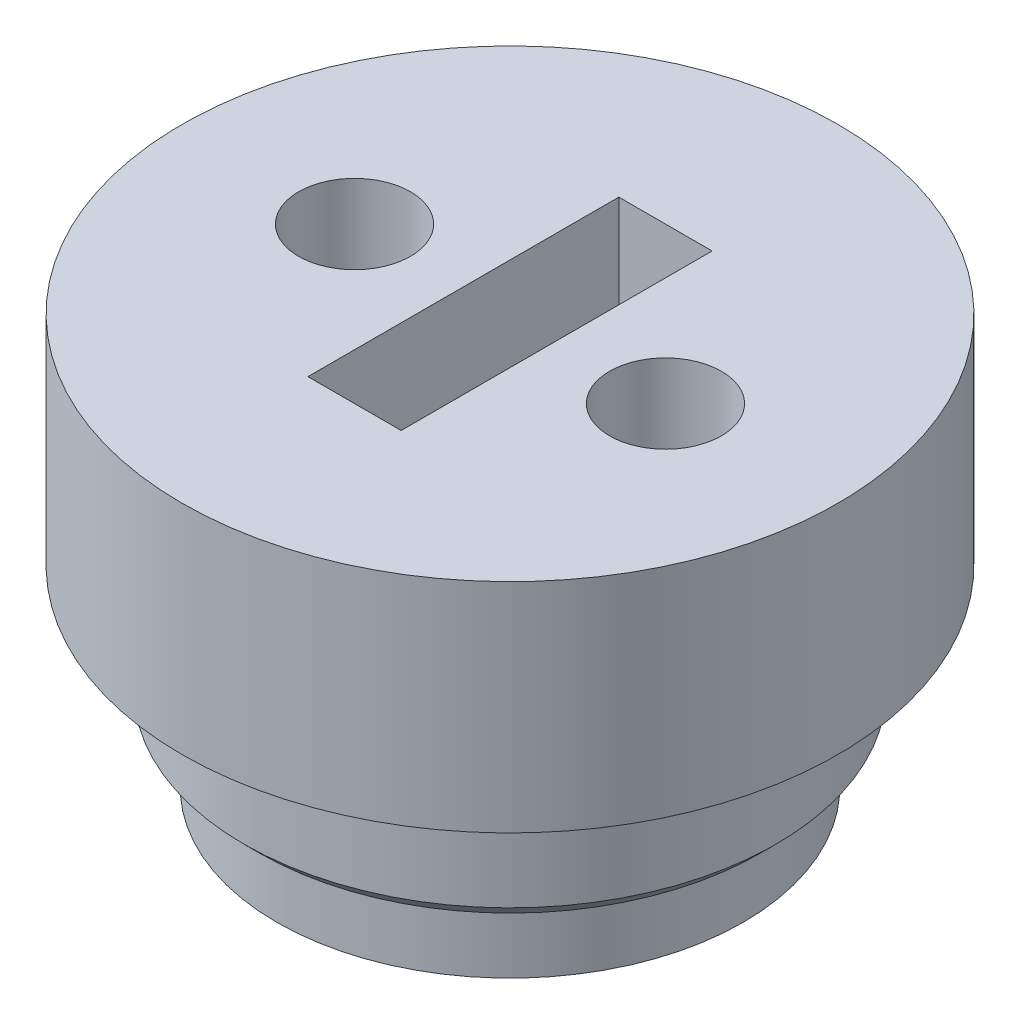
ISO-10303-21;
HEADER;
FILE_DESCRIPTION(('STEP AP214'),'2;1');
FILE_NAME('part.step','',(''),(''),'','','');
FILE_SCHEMA(('AUTOMOTIVE_DESIGN { 1 0 10303 214 1 1 1 1 }'));
ENDSEC;
DATA;
#1=APPLICATION_CONTEXT('core data for automotive mechanical design processes');
#2=APPLICATION_PROTOCOL_DEFINITION('international standard','automotive_design',2000,#1);
#3=PRODUCT_CONTEXT('',#1,'mechanical');
#4=PRODUCT('Part','Part','',(#3));
#5=PRODUCT_RELATED_PRODUCT_CATEGORY('part','',(#4));
#6=PRODUCT_DEFINITION_FORMATION('','',#4);
#7=PRODUCT_DEFINITION_CONTEXT('part definition',#1,'design');
#8=PRODUCT_DEFINITION('design','',#6,#7);
#9=PRODUCT_DEFINITION_SHAPE('','',#8);
#10=(LENGTH_UNIT() NAMED_UNIT(*) SI_UNIT(.MILLI.,.METRE.));
#11=(NAMED_UNIT(*) PLANE_ANGLE_UNIT() SI_UNIT($,.RADIAN.));
#12=(NAMED_UNIT(*) SI_UNIT($,.STERADIAN.) SOLID_ANGLE_UNIT());
#13=UNCERTAINTY_MEASURE_WITH_UNIT(LENGTH_MEASURE(1.E-05),#10,'distance_accuracy_value','');
#14=(GEOMETRIC_REPRESENTATION_CONTEXT(3) GLOBAL_UNCERTAINTY_ASSIGNED_CONTEXT((#13)) GLOBAL_UNIT_ASSIGNED_CONTEXT((#10,
#11,#12)) REPRESENTATION_CONTEXT('',''));
#15=CARTESIAN_POINT('',(0.,0.,0.));
#16=DIRECTION('',(0.,0.,1.));
#17=DIRECTION('',(1.,0.,0.));
#18=AXIS2_PLACEMENT_3D('',#15,#16,#17);
#19=CARTESIAN_POINT('',(0.,0.,0.));
#20=DIRECTION('',(0.,1.,0.));
#21=DIRECTION('',(0.,0.,1.));
#22=AXIS2_PLACEMENT_3D('',#19,#20,#21);
#23=PLANE('',#22);
#24=CARTESIAN_POINT('',(0.,0.,0.));
#25=DIRECTION('',(0.,1.,0.));
#26=DIRECTION('',(0.,0.,1.));
#27=AXIS2_PLACEMENT_3D('',#24,#25,#26);
#28=CIRCLE('',#27,8.05);
#29=CARTESIAN_POINT('',(0.,0.,8.05));
#30=VERTEX_POINT('',#29);
#31=EDGE_CURVE('E11',#30,#30,#28,.F.);
#32=ORIENTED_EDGE('',*,*,#31,.T.);
#33=EDGE_LOOP('',(#32));
#34=FACE_BOUND('',#33,.T.);
#35=CARTESIAN_POINT('',(0.,0.,0.));
#36=DIRECTION('',(0.,-1.,0.));
#37=DIRECTION('',(0.,0.,-1.));
#38=AXIS2_PLACEMENT_3D('',#35,#36,#37);
#39=CIRCLE('',#38,7.5);
#40=CARTESIAN_POINT('',(0.,0.,-7.5));
#41=VERTEX_POINT('',#40);
#42=EDGE_CURVE('E127',#41,#41,#39,.T.);
#43=ORIENTED_EDGE('',*,*,#42,.F.);
#44=EDGE_LOOP('',(#43));
#45=FACE_BOUND('',#44,.T.);
#46=ADVANCED_FACE('F44',(#34,#45),#23,.F.);
#47=CARTESIAN_POINT('',(0.,4.,0.));
#48=DIRECTION('',(0.,-1.,0.));
#49=DIRECTION('',(0.,0.,-1.));
#50=AXIS2_PLACEMENT_3D('',#47,#48,#49);
#51=CYLINDRICAL_SURFACE('',#50,8.55);
#52=CARTESIAN_POINT('',(0.,0.500000000000004,0.));
#53=DIRECTION('',(0.,1.,0.));
#54=DIRECTION('',(0.,0.,1.));
#55=AXIS2_PLACEMENT_3D('',#52,#53,#54);
#56=CIRCLE('',#55,8.55);
#57=CARTESIAN_POINT('',(0.,0.500000000000004,8.55));
#58=VERTEX_POINT('',#57);
#59=EDGE_CURVE('E54',#58,#58,#56,.T.);
#60=ORIENTED_EDGE('',*,*,#59,.T.);
#61=EDGE_LOOP('',(#60));
#62=FACE_BOUND('',#61,.T.);
#63=CARTESIAN_POINT('',(0.,4.,0.));
#64=DIRECTION('',(0.,1.,0.));
#65=DIRECTION('',(0.,0.,1.));
#66=AXIS2_PLACEMENT_3D('',#63,#64,#65);
#67=CIRCLE('',#66,8.55);
#68=CARTESIAN_POINT('',(0.,4.,8.55));
#69=VERTEX_POINT('',#68);
#70=EDGE_CURVE('E128',#69,#69,#67,.T.);
#71=ORIENTED_EDGE('',*,*,#70,.F.);
#72=EDGE_LOOP('',(#71));
#73=FACE_BOUND('',#72,.T.);
#74=ADVANCED_FACE('F163',(#62,#73),#51,.T.);
#75=CARTESIAN_POINT('',(1.5,4.,5.));
#76=DIRECTION('',(-1.,0.,0.));
#77=DIRECTION('',(0.,0.,1.));
#78=AXIS2_PLACEMENT_3D('',#75,#76,#77);
#79=PLANE('',#78);
#80=DIRECTION('',(0.,-1.,0.));
#81=VECTOR('',#80,1.);
#82=CARTESIAN_POINT('',(1.5,4.,-5.));
#83=LINE('',#82,#81);
#84=CARTESIAN_POINT('',(1.5,11.,-5.));
#85=VERTEX_POINT('',#84);
#86=CARTESIAN_POINT('',(1.5,-2.2,-5.));
#87=VERTEX_POINT('',#86);
#88=EDGE_CURVE('E68',#85,#87,#83,.T.);
#89=ORIENTED_EDGE('',*,*,#88,.T.);
#90=DIRECTION('',(0.,0.,1.));
#91=VECTOR('',#90,1.);
#92=CARTESIAN_POINT('',(1.5,-2.2,5.));
#93=LINE('',#92,#91);
#94=CARTESIAN_POINT('',(1.5,-2.2,5.));
#95=VERTEX_POINT('',#94);
#96=EDGE_CURVE('E114',#87,#95,#93,.T.);
#97=ORIENTED_EDGE('',*,*,#96,.T.);
#98=DIRECTION('',(0.,-1.,0.));
#99=VECTOR('',#98,1.);
#100=CARTESIAN_POINT('',(1.5,4.,5.));
#101=LINE('',#100,#99);
#102=CARTESIAN_POINT('',(1.5,11.,5.));
#103=VERTEX_POINT('',#102);
#104=EDGE_CURVE('E64',#103,#95,#101,.T.);
#105=ORIENTED_EDGE('',*,*,#104,.F.);
#106=DIRECTION('',(0.,0.,-1.));
#107=VECTOR('',#106,1.);
#108=CARTESIAN_POINT('',(1.5,11.,5.));
#109=LINE('',#108,#107);
#110=EDGE_CURVE('E136',#103,#85,#109,.T.);
#111=ORIENTED_EDGE('',*,*,#110,.T.);
#112=EDGE_LOOP('',(#89,#97,#105,#111));
#113=FACE_BOUND('',#112,.T.);
#114=ADVANCED_FACE('F184',(#113),#79,.T.);
#115=CARTESIAN_POINT('',(-1.5,4.,-5.));
#116=DIRECTION('',(0.,0.,1.));
#117=DIRECTION('',(1.,0.,0.));
#118=AXIS2_PLACEMENT_3D('',#115,#116,#117);
#119=PLANE('',#118);
#120=DIRECTION('',(0.,-1.,0.));
#121=VECTOR('',#120,1.);
#122=CARTESIAN_POINT('',(-1.5,4.,-5.));
#123=LINE('',#122,#121);
#124=CARTESIAN_POINT('',(-1.5,11.,-5.));
#125=VERTEX_POINT('',#124);
#126=CARTESIAN_POINT('',(-1.5,-2.2,-5.));
#127=VERTEX_POINT('',#126);
#128=EDGE_CURVE('E99',#125,#127,#123,.T.);
#129=ORIENTED_EDGE('',*,*,#128,.T.);
#130=DIRECTION('',(1.,0.,0.));
#131=VECTOR('',#130,1.);
#132=CARTESIAN_POINT('',(1.5,-2.2,-5.));
#133=LINE('',#132,#131);
#134=EDGE_CURVE('E111',#127,#87,#133,.T.);
#135=ORIENTED_EDGE('',*,*,#134,.T.);
#136=ORIENTED_EDGE('',*,*,#88,.F.);
#137=DIRECTION('',(-1.,0.,0.));
#138=VECTOR('',#137,1.);
#139=CARTESIAN_POINT('',(1.5,11.,-5.));
#140=LINE('',#139,#138);
#141=EDGE_CURVE('E123',#85,#125,#140,.T.);
#142=ORIENTED_EDGE('',*,*,#141,.T.);
#143=EDGE_LOOP('',(#129,#135,#136,#142));
#144=FACE_BOUND('',#143,.T.);
#145=ADVANCED_FACE('F188',(#144),#119,.T.);
#146=CARTESIAN_POINT('',(-1.5,4.,5.));
#147=DIRECTION('',(1.,0.,0.));
#148=DIRECTION('',(0.,0.,-1.));
#149=AXIS2_PLACEMENT_3D('',#146,#147,#148);
#150=PLANE('',#149);
#151=DIRECTION('',(0.,-1.,0.));
#152=VECTOR('',#151,1.);
#153=CARTESIAN_POINT('',(-1.5,4.,5.));
#154=LINE('',#153,#152);
#155=CARTESIAN_POINT('',(-1.5,11.,5.));
#156=VERTEX_POINT('',#155);
#157=CARTESIAN_POINT('',(-1.5,-2.2,5.));
#158=VERTEX_POINT('',#157);
#159=EDGE_CURVE('E86',#156,#158,#154,.T.);
#160=ORIENTED_EDGE('',*,*,#159,.T.);
#161=DIRECTION('',(0.,0.,-1.));
#162=VECTOR('',#161,1.);
#163=CARTESIAN_POINT('',(-1.5,-2.2,-5.));
#164=LINE('',#163,#162);
#165=EDGE_CURVE('E91',#158,#127,#164,.T.);
#166=ORIENTED_EDGE('',*,*,#165,.T.);
#167=ORIENTED_EDGE('',*,*,#128,.F.);
#168=DIRECTION('',(0.,0.,1.));
#169=VECTOR('',#168,1.);
#170=CARTESIAN_POINT('',(-1.5,11.,-5.));
#171=LINE('',#170,#169);
#172=EDGE_CURVE('E98',#125,#156,#171,.T.);
#173=ORIENTED_EDGE('',*,*,#172,.T.);
#174=EDGE_LOOP('',(#160,#166,#167,#173));
#175=FACE_BOUND('',#174,.T.);
#176=ADVANCED_FACE('F93',(#175),#150,.T.);
#177=CARTESIAN_POINT('',(-1.5,4.,5.));
#178=DIRECTION('',(0.,0.,-1.));
#179=DIRECTION('',(-1.,0.,0.));
#180=AXIS2_PLACEMENT_3D('',#177,#178,#179);
#181=PLANE('',#180);
#182=ORIENTED_EDGE('',*,*,#104,.T.);
#183=DIRECTION('',(-1.,0.,0.));
#184=VECTOR('',#183,1.);
#185=CARTESIAN_POINT('',(-1.5,-2.2,5.));
#186=LINE('',#185,#184);
#187=EDGE_CURVE('E101',#95,#158,#186,.T.);
#188=ORIENTED_EDGE('',*,*,#187,.T.);
#189=ORIENTED_EDGE('',*,*,#159,.F.);
#190=DIRECTION('',(1.,0.,0.));
#191=VECTOR('',#190,1.);
#192=CARTESIAN_POINT('',(-1.5,11.,5.));
#193=LINE('',#192,#191);
#194=EDGE_CURVE('E133',#156,#103,#193,.T.);
#195=ORIENTED_EDGE('',*,*,#194,.T.);
#196=EDGE_LOOP('',(#182,#188,#189,#195));
#197=FACE_BOUND('',#196,.T.);
#198=ADVANCED_FACE('F104',(#197),#181,.T.);
#199=CARTESIAN_POINT('',(0.,11.,0.));
#200=DIRECTION('',(0.,1.,0.));
#201=DIRECTION('',(0.,0.,1.));
#202=AXIS2_PLACEMENT_3D('',#199,#200,#201);
#203=PLANE('',#202);
#204=CARTESIAN_POINT('',(-5.,11.,0.));
#205=DIRECTION('',(0.,-1.,0.));
#206=DIRECTION('',(0.,0.,-1.));
#207=AXIS2_PLACEMENT_3D('',#204,#205,#206);
#208=CIRCLE('',#207,1.8);
#209=CARTESIAN_POINT('',(-5.,11.,-1.8));
#210=VERTEX_POINT('',#209);
#211=EDGE_CURVE('E228',#210,#210,#208,.T.);
#212=ORIENTED_EDGE('',*,*,#211,.T.);
#213=EDGE_LOOP('',(#212));
#214=FACE_BOUND('',#213,.T.);
#215=CARTESIAN_POINT('',(5.,11.,0.));
#216=DIRECTION('',(0.,-1.,0.));
#217=DIRECTION('',(0.,0.,-1.));
#218=AXIS2_PLACEMENT_3D('',#215,#216,#217);
#219=CIRCLE('',#218,1.8);
#220=CARTESIAN_POINT('',(5.,11.,-1.8));
#221=VERTEX_POINT('',#220);
#222=EDGE_CURVE('E232',#221,#221,#219,.T.);
#223=ORIENTED_EDGE('',*,*,#222,.T.);
#224=EDGE_LOOP('',(#223));
#225=FACE_BOUND('',#224,.T.);
#226=CARTESIAN_POINT('',(0.,11.,0.));
#227=DIRECTION('',(0.,1.,0.));
#228=DIRECTION('',(0.,0.,1.));
#229=AXIS2_PLACEMENT_3D('',#226,#227,#228);
#230=CIRCLE('',#229,10.55);
#231=CARTESIAN_POINT('',(0.,11.,10.55));
#232=VERTEX_POINT('',#231);
#233=EDGE_CURVE('E145',#232,#232,#230,.T.);
#234=ORIENTED_EDGE('',*,*,#233,.T.);
#235=EDGE_LOOP('',(#234));
#236=FACE_BOUND('',#235,.T.);
#237=ORIENTED_EDGE('',*,*,#172,.F.);
#238=ORIENTED_EDGE('',*,*,#141,.F.);
#239=ORIENTED_EDGE('',*,*,#110,.F.);
#240=ORIENTED_EDGE('',*,*,#194,.F.);
#241=EDGE_LOOP('',(#237,#238,#239,#240));
#242=FACE_BOUND('',#241,.T.);
#243=ADVANCED_FACE('F199',(#214,#225,#236,#242),#203,.T.);
#244=CARTESIAN_POINT('',(0.,4.,0.));
#245=DIRECTION('',(0.,1.,0.));
#246=DIRECTION('',(0.,0.,1.));
#247=AXIS2_PLACEMENT_3D('',#244,#245,#246);
#248=PLANE('',#247);
#249=ORIENTED_EDGE('',*,*,#70,.T.);
#250=EDGE_LOOP('',(#249));
#251=FACE_BOUND('',#250,.T.);
#252=CARTESIAN_POINT('',(0.,4.,0.));
#253=DIRECTION('',(0.,1.,0.));
#254=DIRECTION('',(0.,0.,1.));
#255=AXIS2_PLACEMENT_3D('',#252,#253,#254);
#256=CIRCLE('',#255,10.55);
#257=CARTESIAN_POINT('',(0.,4.,10.55));
#258=VERTEX_POINT('',#257);
#259=EDGE_CURVE('E142',#258,#258,#256,.T.);
#260=ORIENTED_EDGE('',*,*,#259,.F.);
#261=EDGE_LOOP('',(#260));
#262=FACE_BOUND('',#261,.T.);
#263=ADVANCED_FACE('F203',(#251,#262),#248,.F.);
#264=CARTESIAN_POINT('',(0.,11.,0.));
#265=DIRECTION('',(0.,-1.,0.));
#266=DIRECTION('',(0.,0.,-1.));
#267=AXIS2_PLACEMENT_3D('',#264,#265,#266);
#268=CYLINDRICAL_SURFACE('',#267,10.55);
#269=ORIENTED_EDGE('',*,*,#233,.F.);
#270=EDGE_LOOP('',(#269));
#271=FACE_BOUND('',#270,.T.);
#272=ORIENTED_EDGE('',*,*,#259,.T.);
#273=EDGE_LOOP('',(#272));
#274=FACE_BOUND('',#273,.T.);
#275=ADVANCED_FACE('F200',(#271,#274),#268,.T.);
#276=CARTESIAN_POINT('',(0.,-2.2,0.));
#277=DIRECTION('',(0.,-1.,0.));
#278=DIRECTION('',(0.,0.,-1.));
#279=AXIS2_PLACEMENT_3D('',#276,#277,#278);
#280=PLANE('',#279);
#281=CARTESIAN_POINT('',(0.,-2.2,0.));
#282=DIRECTION('',(0.,-1.,0.));
#283=DIRECTION('',(0.,0.,-1.));
#284=AXIS2_PLACEMENT_3D('',#281,#282,#283);
#285=CIRCLE('',#284,7.5);
#286=CARTESIAN_POINT('',(0.,-2.2,-7.5));
#287=VERTEX_POINT('',#286);
#288=EDGE_CURVE('E122',#287,#287,#285,.T.);
#289=ORIENTED_EDGE('',*,*,#288,.T.);
#290=EDGE_LOOP('',(#289));
#291=FACE_BOUND('',#290,.T.);
#292=ORIENTED_EDGE('',*,*,#165,.F.);
#293=ORIENTED_EDGE('',*,*,#187,.F.);
#294=ORIENTED_EDGE('',*,*,#96,.F.);
#295=ORIENTED_EDGE('',*,*,#134,.F.);
#296=EDGE_LOOP('',(#292,#293,#294,#295));
#297=FACE_BOUND('',#296,.T.);
#298=ADVANCED_FACE('F109',(#291,#297),#280,.T.);
#299=CARTESIAN_POINT('',(0.,-2.2,0.));
#300=DIRECTION('',(0.,1.,0.));
#301=DIRECTION('',(0.,0.,1.));
#302=AXIS2_PLACEMENT_3D('',#299,#300,#301);
#303=CYLINDRICAL_SURFACE('',#302,7.5);
#304=ORIENTED_EDGE('',*,*,#288,.F.);
#305=EDGE_LOOP('',(#304));
#306=FACE_BOUND('',#305,.T.);
#307=ORIENTED_EDGE('',*,*,#42,.T.);
#308=EDGE_LOOP('',(#307));
#309=FACE_BOUND('',#308,.T.);
#310=ADVANCED_FACE('F168',(#306,#309),#303,.T.);
#311=CARTESIAN_POINT('',(0.,0.500000000000004,0.));
#312=DIRECTION('',(0.,1.,0.));
#313=DIRECTION('',(0.,0.,1.));
#314=AXIS2_PLACEMENT_3D('',#311,#312,#313);
#315=CONICAL_SURFACE('',#314,8.55,0.78539816339745);
#316=ORIENTED_EDGE('',*,*,#31,.F.);
#317=EDGE_LOOP('',(#316));
#318=FACE_BOUND('',#317,.T.);
#319=ORIENTED_EDGE('',*,*,#59,.F.);
#320=EDGE_LOOP('',(#319));
#321=FACE_BOUND('',#320,.T.);
#322=ADVANCED_FACE('F48',(#318,#321),#315,.T.);
#323=CARTESIAN_POINT('',(5.,0.999999999999999,0.));
#324=DIRECTION('',(0.,1.,0.));
#325=DIRECTION('',(0.,0.,1.));
#326=AXIS2_PLACEMENT_3D('',#323,#324,#325);
#327=CYLINDRICAL_SURFACE('',#326,1.8);
#328=CARTESIAN_POINT('',(5.,0.999999999999999,0.));
#329=DIRECTION('',(0.,-1.,0.));
#330=DIRECTION('',(0.,0.,-1.));
#331=AXIS2_PLACEMENT_3D('',#328,#329,#330);
#332=CIRCLE('',#331,1.8);
#333=CARTESIAN_POINT('',(5.,0.999999999999999,-1.8));
#334=VERTEX_POINT('',#333);
#335=EDGE_CURVE('E229',#334,#334,#332,.T.);
#336=ORIENTED_EDGE('',*,*,#335,.T.);
#337=EDGE_LOOP('',(#336));
#338=FACE_BOUND('',#337,.T.);
#339=ORIENTED_EDGE('',*,*,#222,.F.);
#340=EDGE_LOOP('',(#339));
#341=FACE_BOUND('',#340,.T.);
#342=ADVANCED_FACE('F164',(#338,#341),#327,.F.);
#343=CARTESIAN_POINT('',(5.,0.999999999999999,0.));
#344=DIRECTION('',(0.,-1.,0.));
#345=DIRECTION('',(0.,0.,-1.));
#346=AXIS2_PLACEMENT_3D('',#343,#344,#345);
#347=PLANE('',#346);
#348=ORIENTED_EDGE('',*,*,#335,.F.);
#349=EDGE_LOOP('',(#348));
#350=FACE_BOUND('',#349,.T.);
#351=ADVANCED_FACE('F173',(#350),#347,.F.);
#352=CARTESIAN_POINT('',(-5.,0.999999999999999,0.));
#353=DIRECTION('',(0.,1.,0.));
#354=DIRECTION('',(0.,0.,1.));
#355=AXIS2_PLACEMENT_3D('',#352,#353,#354);
#356=CYLINDRICAL_SURFACE('',#355,1.8);
#357=CARTESIAN_POINT('',(-5.,0.999999999999999,0.));
#358=DIRECTION('',(0.,-1.,0.));
#359=DIRECTION('',(0.,0.,-1.));
#360=AXIS2_PLACEMENT_3D('',#357,#358,#359);
#361=CIRCLE('',#360,1.8);
#362=CARTESIAN_POINT('',(-5.,0.999999999999999,-1.8));
#363=VERTEX_POINT('',#362);
#364=EDGE_CURVE('E108',#363,#363,#361,.T.);
#365=ORIENTED_EDGE('',*,*,#364,.T.);
#366=EDGE_LOOP('',(#365));
#367=FACE_BOUND('',#366,.T.);
#368=ORIENTED_EDGE('',*,*,#211,.F.);
#369=EDGE_LOOP('',(#368));
#370=FACE_BOUND('',#369,.T.);
#371=ADVANCED_FACE('F215',(#367,#370),#356,.F.);
#372=CARTESIAN_POINT('',(-5.,0.999999999999999,0.));
#373=DIRECTION('',(0.,-1.,0.));
#374=DIRECTION('',(0.,0.,-1.));
#375=AXIS2_PLACEMENT_3D('',#372,#373,#374);
#376=PLANE('',#375);
#377=ORIENTED_EDGE('',*,*,#364,.F.);
#378=EDGE_LOOP('',(#377));
#379=FACE_BOUND('',#378,.T.);
#380=ADVANCED_FACE('F219',(#379),#376,.F.);
#381=CLOSED_SHELL('',(#46,#74,#114,#145,#176,#198,#243,#263,#275,#298,#310,#322,#342,#351,#371,#380));
#382=MANIFOLD_SOLID_BREP('B2',#381);
#383=ADVANCED_BREP_SHAPE_REPRESENTATION('',(#18,#382),#14);
#384=SHAPE_DEFINITION_REPRESENTATION(#9,#383);
ENDSEC;
END-ISO-10303-21;
